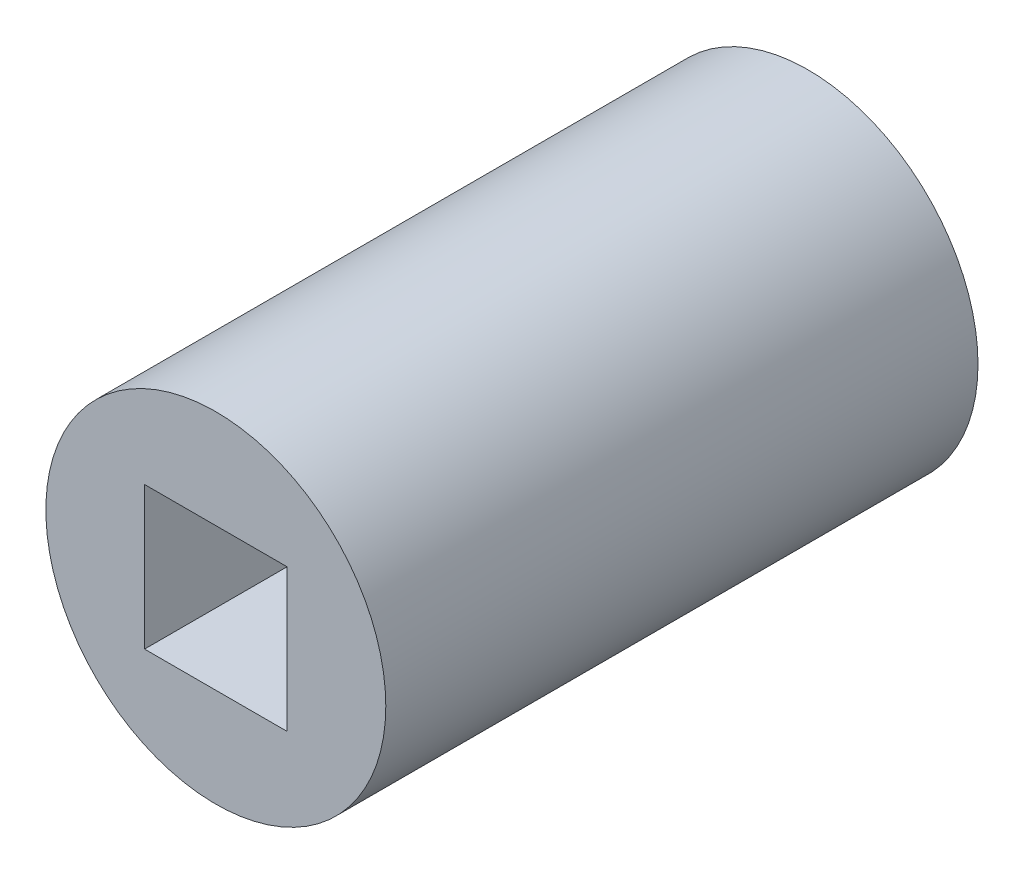
ISO-10303-21;
HEADER;
FILE_DESCRIPTION(('STEP AP214'),'2;1');
FILE_NAME('part.step','',(''),(''),'','','');
FILE_SCHEMA(('AUTOMOTIVE_DESIGN { 1 0 10303 214 1 1 1 1 }'));
ENDSEC;
DATA;
#1=APPLICATION_CONTEXT('core data for automotive mechanical design processes');
#2=APPLICATION_PROTOCOL_DEFINITION('international standard','automotive_design',2000,#1);
#3=PRODUCT_CONTEXT('',#1,'mechanical');
#4=PRODUCT('Part','Part','',(#3));
#5=PRODUCT_RELATED_PRODUCT_CATEGORY('part','',(#4));
#6=PRODUCT_DEFINITION_FORMATION('','',#4);
#7=PRODUCT_DEFINITION_CONTEXT('part definition',#1,'design');
#8=PRODUCT_DEFINITION('design','',#6,#7);
#9=PRODUCT_DEFINITION_SHAPE('','',#8);
#10=(LENGTH_UNIT() NAMED_UNIT(*) SI_UNIT(.MILLI.,.METRE.));
#11=(NAMED_UNIT(*) PLANE_ANGLE_UNIT() SI_UNIT($,.RADIAN.));
#12=(NAMED_UNIT(*) SI_UNIT($,.STERADIAN.) SOLID_ANGLE_UNIT());
#13=UNCERTAINTY_MEASURE_WITH_UNIT(LENGTH_MEASURE(1.E-05),#10,'distance_accuracy_value','');
#14=(GEOMETRIC_REPRESENTATION_CONTEXT(3) GLOBAL_UNCERTAINTY_ASSIGNED_CONTEXT((#13)) GLOBAL_UNIT_ASSIGNED_CONTEXT((#10,
#11,#12)) REPRESENTATION_CONTEXT('',''));
#15=CARTESIAN_POINT('',(0.,0.,0.));
#16=DIRECTION('',(0.,0.,1.));
#17=DIRECTION('',(1.,0.,0.));
#18=AXIS2_PLACEMENT_3D('',#15,#16,#17);
#19=CARTESIAN_POINT('',(0.,0.,-22.));
#20=DIRECTION('',(0.,0.,-1.));
#21=DIRECTION('',(-1.,0.,0.));
#22=AXIS2_PLACEMENT_3D('',#19,#20,#21);
#23=PLANE('',#22);
#24=DIRECTION('',(0.,-1.,0.));
#25=VECTOR('',#24,1.);
#26=CARTESIAN_POINT('',(-3.25,-3.25,-22.));
#27=LINE('',#26,#25);
#28=CARTESIAN_POINT('',(-3.25,3.25,-22.));
#29=VERTEX_POINT('',#28);
#30=CARTESIAN_POINT('',(-3.25,0.,-22.));
#31=VERTEX_POINT('',#30);
#32=EDGE_CURVE('E140',#29,#31,#27,.T.);
#33=ORIENTED_EDGE('',*,*,#32,.T.);
#34=CARTESIAN_POINT('',(0.,0.,-22.));
#35=DIRECTION('',(0.,0.,-1.));
#36=DIRECTION('',(-1.,0.,0.));
#37=AXIS2_PLACEMENT_3D('',#34,#35,#36);
#38=CIRCLE('',#37,3.25);
#39=CARTESIAN_POINT('',(0.,3.25,-22.));
#40=VERTEX_POINT('',#39);
#41=EDGE_CURVE('E11',#31,#40,#38,.T.);
#42=ORIENTED_EDGE('',*,*,#41,.T.);
#43=DIRECTION('',(-1.,0.,0.));
#44=VECTOR('',#43,1.);
#45=CARTESIAN_POINT('',(3.25,3.25,-22.));
#46=LINE('',#45,#44);
#47=EDGE_CURVE('E58',#40,#29,#46,.T.);
#48=ORIENTED_EDGE('',*,*,#47,.T.);
#49=EDGE_LOOP('',(#33,#42,#48));
#50=FACE_BOUND('',#49,.T.);
#51=ADVANCED_FACE('F39',(#50),#23,.F.);
#52=CARTESIAN_POINT('',(3.25,3.25,-22.));
#53=VERTEX_POINT('',#52);
#54=EDGE_CURVE('E137',#53,#40,#46,.T.);
#55=ORIENTED_EDGE('',*,*,#54,.T.);
#56=CARTESIAN_POINT('',(3.25,0.,-22.));
#57=VERTEX_POINT('',#56);
#58=EDGE_CURVE('E48',#40,#57,#38,.T.);
#59=ORIENTED_EDGE('',*,*,#58,.T.);
#60=DIRECTION('',(0.,1.,0.));
#61=VECTOR('',#60,1.);
#62=CARTESIAN_POINT('',(3.25,-3.25,-22.));
#63=LINE('',#62,#61);
#64=EDGE_CURVE('E145',#57,#53,#63,.T.);
#65=ORIENTED_EDGE('',*,*,#64,.T.);
#66=EDGE_LOOP('',(#55,#59,#65));
#67=FACE_BOUND('',#66,.T.);
#68=ADVANCED_FACE('F155',(#67),#23,.F.);
#69=CARTESIAN_POINT('',(3.25,-3.25,-22.));
#70=VERTEX_POINT('',#69);
#71=EDGE_CURVE('E102',#70,#57,#63,.T.);
#72=ORIENTED_EDGE('',*,*,#71,.T.);
#73=CARTESIAN_POINT('',(0.,-3.25,-22.));
#74=VERTEX_POINT('',#73);
#75=EDGE_CURVE('E93',#57,#74,#38,.T.);
#76=ORIENTED_EDGE('',*,*,#75,.T.);
#77=DIRECTION('',(1.,0.,0.));
#78=VECTOR('',#77,1.);
#79=CARTESIAN_POINT('',(3.25,-3.25,-22.));
#80=LINE('',#79,#78);
#81=EDGE_CURVE('E101',#74,#70,#80,.T.);
#82=ORIENTED_EDGE('',*,*,#81,.T.);
#83=EDGE_LOOP('',(#72,#76,#82));
#84=FACE_BOUND('',#83,.T.);
#85=ADVANCED_FACE('F99',(#84),#23,.F.);
#86=CARTESIAN_POINT('',(-3.25,-3.25,-27.));
#87=DIRECTION('',(-1.,0.,0.));
#88=DIRECTION('',(0.,0.,1.));
#89=AXIS2_PLACEMENT_3D('',#86,#87,#88);
#90=PLANE('',#89);
#91=CARTESIAN_POINT('',(-3.25,-3.25,-22.));
#92=VERTEX_POINT('',#91);
#93=EDGE_CURVE('E114',#31,#92,#27,.T.);
#94=ORIENTED_EDGE('',*,*,#93,.F.);
#95=ORIENTED_EDGE('',*,*,#32,.F.);
#96=DIRECTION('',(0.,0.,1.));
#97=VECTOR('',#96,1.);
#98=CARTESIAN_POINT('',(-3.25,3.25,-27.));
#99=LINE('',#98,#97);
#100=CARTESIAN_POINT('',(-3.25,3.25,0.));
#101=VERTEX_POINT('',#100);
#102=EDGE_CURVE('E117',#29,#101,#99,.T.);
#103=ORIENTED_EDGE('',*,*,#102,.T.);
#104=DIRECTION('',(0.,-1.,0.));
#105=VECTOR('',#104,1.);
#106=CARTESIAN_POINT('',(-3.25,-3.25,0.));
#107=LINE('',#106,#105);
#108=CARTESIAN_POINT('',(-3.25,-3.25,0.));
#109=VERTEX_POINT('',#108);
#110=EDGE_CURVE('E134',#101,#109,#107,.T.);
#111=ORIENTED_EDGE('',*,*,#110,.T.);
#112=DIRECTION('',(0.,0.,1.));
#113=VECTOR('',#112,1.);
#114=CARTESIAN_POINT('',(-3.25,-3.25,-27.));
#115=LINE('',#114,#113);
#116=EDGE_CURVE('E124',#92,#109,#115,.T.);
#117=ORIENTED_EDGE('',*,*,#116,.F.);
#118=EDGE_LOOP('',(#94,#95,#103,#111,#117));
#119=FACE_BOUND('',#118,.T.);
#120=ADVANCED_FACE('F170',(#119),#90,.F.);
#121=CARTESIAN_POINT('',(3.25,3.25,-27.));
#122=DIRECTION('',(0.,1.,0.));
#123=DIRECTION('',(-1.,0.,0.));
#124=AXIS2_PLACEMENT_3D('',#121,#122,#123);
#125=PLANE('',#124);
#126=ORIENTED_EDGE('',*,*,#47,.F.);
#127=ORIENTED_EDGE('',*,*,#54,.F.);
#128=DIRECTION('',(0.,0.,1.));
#129=VECTOR('',#128,1.);
#130=CARTESIAN_POINT('',(3.25,3.25,-27.));
#131=LINE('',#130,#129);
#132=CARTESIAN_POINT('',(3.25,3.25,0.));
#133=VERTEX_POINT('',#132);
#134=EDGE_CURVE('E122',#53,#133,#131,.T.);
#135=ORIENTED_EDGE('',*,*,#134,.T.);
#136=DIRECTION('',(-1.,0.,0.));
#137=VECTOR('',#136,1.);
#138=CARTESIAN_POINT('',(3.25,3.25,0.));
#139=LINE('',#138,#137);
#140=EDGE_CURVE('E125',#133,#101,#139,.T.);
#141=ORIENTED_EDGE('',*,*,#140,.T.);
#142=ORIENTED_EDGE('',*,*,#102,.F.);
#143=EDGE_LOOP('',(#126,#127,#135,#141,#142));
#144=FACE_BOUND('',#143,.T.);
#145=ADVANCED_FACE('F156',(#144),#125,.F.);
#146=CARTESIAN_POINT('',(3.25,-3.25,-27.));
#147=DIRECTION('',(1.,0.,0.));
#148=DIRECTION('',(0.,0.,-1.));
#149=AXIS2_PLACEMENT_3D('',#146,#147,#148);
#150=PLANE('',#149);
#151=ORIENTED_EDGE('',*,*,#64,.F.);
#152=ORIENTED_EDGE('',*,*,#71,.F.);
#153=DIRECTION('',(0.,0.,1.));
#154=VECTOR('',#153,1.);
#155=CARTESIAN_POINT('',(3.25,-3.25,-27.));
#156=LINE('',#155,#154);
#157=CARTESIAN_POINT('',(3.25,-3.25,0.));
#158=VERTEX_POINT('',#157);
#159=EDGE_CURVE('E109',#70,#158,#156,.T.);
#160=ORIENTED_EDGE('',*,*,#159,.T.);
#161=DIRECTION('',(0.,1.,0.));
#162=VECTOR('',#161,1.);
#163=CARTESIAN_POINT('',(3.25,-3.25,0.));
#164=LINE('',#163,#162);
#165=EDGE_CURVE('E128',#158,#133,#164,.T.);
#166=ORIENTED_EDGE('',*,*,#165,.T.);
#167=ORIENTED_EDGE('',*,*,#134,.F.);
#168=EDGE_LOOP('',(#151,#152,#160,#166,#167));
#169=FACE_BOUND('',#168,.T.);
#170=ADVANCED_FACE('F158',(#169),#150,.F.);
#171=CARTESIAN_POINT('',(3.25,-3.25,-27.));
#172=DIRECTION('',(0.,-1.,0.));
#173=DIRECTION('',(1.,0.,0.));
#174=AXIS2_PLACEMENT_3D('',#171,#172,#173);
#175=PLANE('',#174);
#176=ORIENTED_EDGE('',*,*,#81,.F.);
#177=EDGE_CURVE('E96',#92,#74,#80,.T.);
#178=ORIENTED_EDGE('',*,*,#177,.F.);
#179=ORIENTED_EDGE('',*,*,#116,.T.);
#180=DIRECTION('',(1.,0.,0.));
#181=VECTOR('',#180,1.);
#182=CARTESIAN_POINT('',(3.25,-3.25,0.));
#183=LINE('',#182,#181);
#184=EDGE_CURVE('E132',#109,#158,#183,.T.);
#185=ORIENTED_EDGE('',*,*,#184,.T.);
#186=ORIENTED_EDGE('',*,*,#159,.F.);
#187=EDGE_LOOP('',(#176,#178,#179,#185,#186));
#188=FACE_BOUND('',#187,.T.);
#189=ADVANCED_FACE('F110',(#188),#175,.F.);
#190=CARTESIAN_POINT('',(0.,0.,-27.));
#191=DIRECTION('',(0.,0.,1.));
#192=DIRECTION('',(1.,0.,0.));
#193=AXIS2_PLACEMENT_3D('',#190,#191,#192);
#194=CYLINDRICAL_SURFACE('',#193,7.75);
#195=CARTESIAN_POINT('',(0.,0.,-27.));
#196=DIRECTION('',(0.,0.,1.));
#197=DIRECTION('',(1.,0.,0.));
#198=AXIS2_PLACEMENT_3D('',#195,#196,#197);
#199=CIRCLE('',#198,7.75);
#200=CARTESIAN_POINT('',(7.75,0.,-27.));
#201=VERTEX_POINT('',#200);
#202=EDGE_CURVE('E112',#201,#201,#199,.T.);
#203=ORIENTED_EDGE('',*,*,#202,.T.);
#204=EDGE_LOOP('',(#203));
#205=FACE_BOUND('',#204,.T.);
#206=CARTESIAN_POINT('',(0.,0.,0.));
#207=DIRECTION('',(0.,0.,1.));
#208=DIRECTION('',(1.,0.,0.));
#209=AXIS2_PLACEMENT_3D('',#206,#207,#208);
#210=CIRCLE('',#209,7.75);
#211=CARTESIAN_POINT('',(7.75,0.,0.));
#212=VERTEX_POINT('',#211);
#213=EDGE_CURVE('E113',#212,#212,#210,.T.);
#214=ORIENTED_EDGE('',*,*,#213,.F.);
#215=EDGE_LOOP('',(#214));
#216=FACE_BOUND('',#215,.T.);
#217=ADVANCED_FACE('F41',(#205,#216),#194,.T.);
#218=CARTESIAN_POINT('',(0.,0.,-27.));
#219=DIRECTION('',(0.,0.,1.));
#220=DIRECTION('',(1.,0.,0.));
#221=AXIS2_PLACEMENT_3D('',#218,#219,#220);
#222=PLANE('',#221);
#223=CARTESIAN_POINT('',(0.,0.,-27.));
#224=DIRECTION('',(0.,0.,-1.));
#225=DIRECTION('',(-1.,0.,0.));
#226=AXIS2_PLACEMENT_3D('',#223,#224,#225);
#227=CIRCLE('',#226,3.25);
#228=CARTESIAN_POINT('',(-3.25,0.,-27.));
#229=VERTEX_POINT('',#228);
#230=EDGE_CURVE('E144',#229,#229,#227,.T.);
#231=ORIENTED_EDGE('',*,*,#230,.F.);
#232=EDGE_LOOP('',(#231));
#233=FACE_BOUND('',#232,.T.);
#234=ORIENTED_EDGE('',*,*,#202,.F.);
#235=EDGE_LOOP('',(#234));
#236=FACE_BOUND('',#235,.T.);
#237=ADVANCED_FACE('F182',(#233,#236),#222,.F.);
#238=CARTESIAN_POINT('',(0.,0.,0.));
#239=DIRECTION('',(0.,0.,1.));
#240=DIRECTION('',(1.,0.,0.));
#241=AXIS2_PLACEMENT_3D('',#238,#239,#240);
#242=PLANE('',#241);
#243=ORIENTED_EDGE('',*,*,#110,.F.);
#244=ORIENTED_EDGE('',*,*,#140,.F.);
#245=ORIENTED_EDGE('',*,*,#165,.F.);
#246=ORIENTED_EDGE('',*,*,#184,.F.);
#247=EDGE_LOOP('',(#243,#244,#245,#246));
#248=FACE_BOUND('',#247,.T.);
#249=ORIENTED_EDGE('',*,*,#213,.T.);
#250=EDGE_LOOP('',(#249));
#251=FACE_BOUND('',#250,.T.);
#252=ADVANCED_FACE('F163',(#248,#251),#242,.T.);
#253=ORIENTED_EDGE('',*,*,#177,.T.);
#254=EDGE_CURVE('E43',#74,#31,#38,.T.);
#255=ORIENTED_EDGE('',*,*,#254,.T.);
#256=ORIENTED_EDGE('',*,*,#93,.T.);
#257=EDGE_LOOP('',(#253,#255,#256));
#258=FACE_BOUND('',#257,.T.);
#259=ADVANCED_FACE('F115',(#258),#23,.F.);
#260=CARTESIAN_POINT('',(0.,0.,-17.));
#261=DIRECTION('',(0.,0.,-1.));
#262=DIRECTION('',(-1.,0.,0.));
#263=AXIS2_PLACEMENT_3D('',#260,#261,#262);
#264=CYLINDRICAL_SURFACE('',#263,3.25);
#265=ORIENTED_EDGE('',*,*,#230,.T.);
#266=EDGE_LOOP('',(#265));
#267=FACE_BOUND('',#266,.T.);
#268=ORIENTED_EDGE('',*,*,#254,.F.);
#269=ORIENTED_EDGE('',*,*,#75,.F.);
#270=ORIENTED_EDGE('',*,*,#58,.F.);
#271=ORIENTED_EDGE('',*,*,#41,.F.);
#272=EDGE_LOOP('',(#268,#269,#270,#271));
#273=FACE_BOUND('',#272,.T.);
#274=ADVANCED_FACE('F89',(#267,#273),#264,.F.);
#275=CLOSED_SHELL('',(#51,#68,#85,#120,#145,#170,#189,#217,#237,#252,#259,#274));
#276=MANIFOLD_SOLID_BREP('B2',#275);
#277=ADVANCED_BREP_SHAPE_REPRESENTATION('',(#18,#276),#14);
#278=SHAPE_DEFINITION_REPRESENTATION(#9,#277);
ENDSEC;
END-ISO-10303-21;
